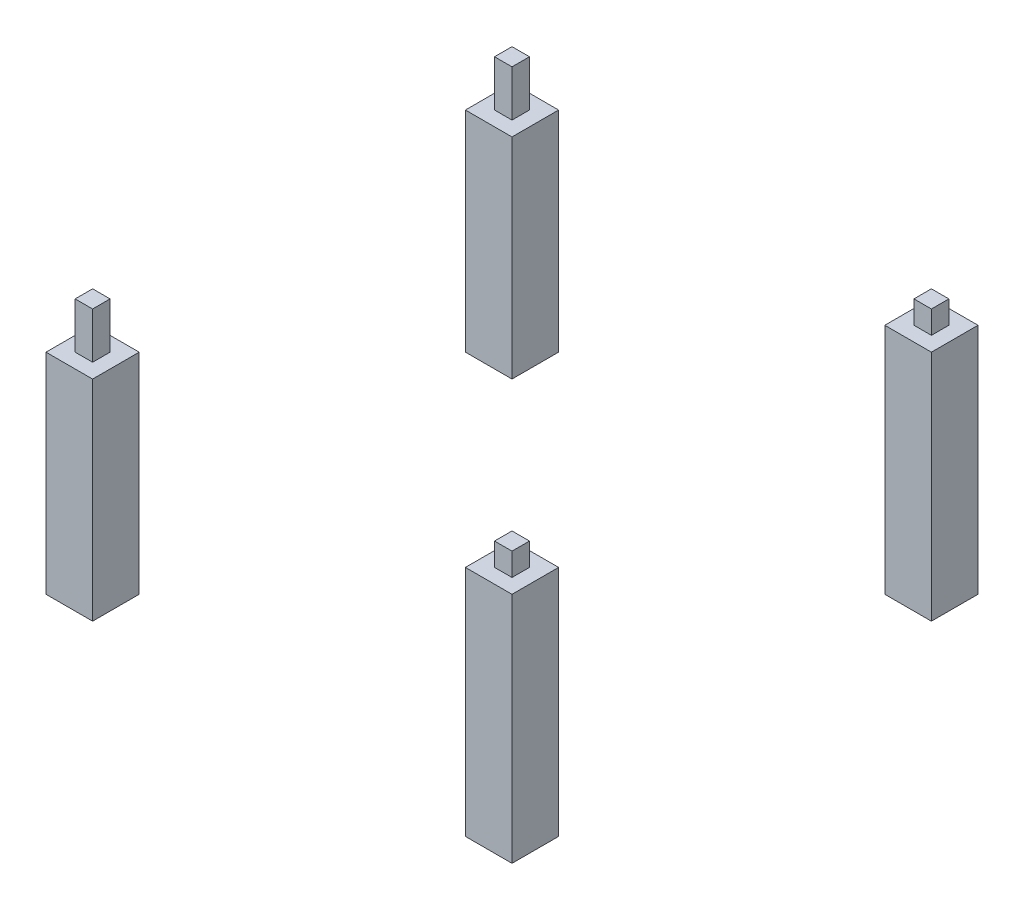
ISO-10303-21;
HEADER;
FILE_DESCRIPTION(('STEP AP214'),'2;1');
FILE_NAME('part.step','',(''),(''),'','','');
FILE_SCHEMA(('AUTOMOTIVE_DESIGN { 1 0 10303 214 1 1 1 1 }'));
ENDSEC;
DATA;
#1=APPLICATION_CONTEXT('core data for automotive mechanical design processes');
#2=APPLICATION_PROTOCOL_DEFINITION('international standard','automotive_design',2000,#1);
#3=PRODUCT_CONTEXT('',#1,'mechanical');
#4=PRODUCT('Part','Part','',(#3));
#5=PRODUCT_RELATED_PRODUCT_CATEGORY('part','',(#4));
#6=PRODUCT_DEFINITION_FORMATION('','',#4);
#7=PRODUCT_DEFINITION_CONTEXT('part definition',#1,'design');
#8=PRODUCT_DEFINITION('design','',#6,#7);
#9=PRODUCT_DEFINITION_SHAPE('','',#8);
#10=(LENGTH_UNIT() NAMED_UNIT(*) SI_UNIT(.MILLI.,.METRE.));
#11=(NAMED_UNIT(*) PLANE_ANGLE_UNIT() SI_UNIT($,.RADIAN.));
#12=(NAMED_UNIT(*) SI_UNIT($,.STERADIAN.) SOLID_ANGLE_UNIT());
#13=UNCERTAINTY_MEASURE_WITH_UNIT(LENGTH_MEASURE(1.E-05),#10,'distance_accuracy_value','');
#14=(GEOMETRIC_REPRESENTATION_CONTEXT(3) GLOBAL_UNCERTAINTY_ASSIGNED_CONTEXT((#13)) GLOBAL_UNIT_ASSIGNED_CONTEXT((#10,
#11,#12)) REPRESENTATION_CONTEXT('',''));
#15=CARTESIAN_POINT('',(0.,0.,0.));
#16=DIRECTION('',(0.,0.,1.));
#17=DIRECTION('',(1.,0.,0.));
#18=AXIS2_PLACEMENT_3D('',#15,#16,#17);
#19=CARTESIAN_POINT('',(0.,100.,0.));
#20=DIRECTION('',(0.,-1.,0.));
#21=DIRECTION('',(0.,0.,-1.));
#22=AXIS2_PLACEMENT_3D('',#19,#20,#21);
#23=PLANE('',#22);
#24=DIRECTION('',(0.,0.,-1.));
#25=VECTOR('',#24,1.);
#26=CARTESIAN_POINT('',(100.,100.,-80.));
#27=LINE('',#26,#25);
#28=CARTESIAN_POINT('',(100.,100.,-80.));
#29=VERTEX_POINT('',#28);
#30=CARTESIAN_POINT('',(100.,100.,-100.));
#31=VERTEX_POINT('',#30);
#32=EDGE_CURVE('E59',#29,#31,#27,.T.);
#33=ORIENTED_EDGE('',*,*,#32,.T.);
#34=DIRECTION('',(-1.,0.,0.));
#35=VECTOR('',#34,1.);
#36=CARTESIAN_POINT('',(80.,100.,-100.));
#37=LINE('',#36,#35);
#38=CARTESIAN_POINT('',(80.,100.,-100.));
#39=VERTEX_POINT('',#38);
#40=EDGE_CURVE('E174',#31,#39,#37,.T.);
#41=ORIENTED_EDGE('',*,*,#40,.T.);
#42=DIRECTION('',(0.,0.,1.));
#43=VECTOR('',#42,1.);
#44=CARTESIAN_POINT('',(80.,100.,-80.));
#45=LINE('',#44,#43);
#46=CARTESIAN_POINT('',(80.,100.,-80.));
#47=VERTEX_POINT('',#46);
#48=EDGE_CURVE('E173',#39,#47,#45,.T.);
#49=ORIENTED_EDGE('',*,*,#48,.T.);
#50=DIRECTION('',(1.,0.,0.));
#51=VECTOR('',#50,1.);
#52=CARTESIAN_POINT('',(80.,100.,-80.));
#53=LINE('',#52,#51);
#54=EDGE_CURVE('E166',#47,#29,#53,.T.);
#55=ORIENTED_EDGE('',*,*,#54,.T.);
#56=EDGE_LOOP('',(#33,#41,#49,#55));
#57=FACE_BOUND('',#56,.T.);
#58=DIRECTION('',(0.,0.,-1.));
#59=VECTOR('',#58,1.);
#60=CARTESIAN_POINT('',(93.75,100.,-86.25));
#61=LINE('',#60,#59);
#62=CARTESIAN_POINT('',(93.75,100.,-86.25));
#63=VERTEX_POINT('',#62);
#64=CARTESIAN_POINT('',(93.75,100.,-93.75));
#65=VERTEX_POINT('',#64);
#66=EDGE_CURVE('E72',#63,#65,#61,.T.);
#67=ORIENTED_EDGE('',*,*,#66,.F.);
#68=DIRECTION('',(1.,0.,0.));
#69=VECTOR('',#68,1.);
#70=CARTESIAN_POINT('',(86.25,100.,-86.25));
#71=LINE('',#70,#69);
#72=CARTESIAN_POINT('',(86.25,100.,-86.25));
#73=VERTEX_POINT('',#72);
#74=EDGE_CURVE('E76',#73,#63,#71,.T.);
#75=ORIENTED_EDGE('',*,*,#74,.F.);
#76=DIRECTION('',(0.,0.,1.));
#77=VECTOR('',#76,1.);
#78=CARTESIAN_POINT('',(86.25,100.,-86.25));
#79=LINE('',#78,#77);
#80=CARTESIAN_POINT('',(86.25,100.,-93.75));
#81=VERTEX_POINT('',#80);
#82=EDGE_CURVE('E117',#81,#73,#79,.T.);
#83=ORIENTED_EDGE('',*,*,#82,.F.);
#84=DIRECTION('',(-1.,0.,0.));
#85=VECTOR('',#84,1.);
#86=CARTESIAN_POINT('',(86.25,100.,-93.75));
#87=LINE('',#86,#85);
#88=EDGE_CURVE('E119',#65,#81,#87,.T.);
#89=ORIENTED_EDGE('',*,*,#88,.F.);
#90=EDGE_LOOP('',(#67,#75,#83,#89));
#91=FACE_BOUND('',#90,.T.);
#92=ADVANCED_FACE('F56',(#57,#91),#23,.F.);
#93=CARTESIAN_POINT('',(100.,100.,-80.));
#94=DIRECTION('',(-1.,0.,0.));
#95=DIRECTION('',(0.,0.,1.));
#96=AXIS2_PLACEMENT_3D('',#93,#94,#95);
#97=PLANE('',#96);
#98=DIRECTION('',(0.,0.,-1.));
#99=VECTOR('',#98,1.);
#100=CARTESIAN_POINT('',(100.,0.,-80.));
#101=LINE('',#100,#99);
#102=CARTESIAN_POINT('',(100.,0.,-80.));
#103=VERTEX_POINT('',#102);
#104=CARTESIAN_POINT('',(100.,0.,-100.));
#105=VERTEX_POINT('',#104);
#106=EDGE_CURVE('E12',#103,#105,#101,.T.);
#107=ORIENTED_EDGE('',*,*,#106,.T.);
#108=DIRECTION('',(0.,-1.,0.));
#109=VECTOR('',#108,1.);
#110=CARTESIAN_POINT('',(100.,100.,-100.));
#111=LINE('',#110,#109);
#112=EDGE_CURVE('E148',#31,#105,#111,.T.);
#113=ORIENTED_EDGE('',*,*,#112,.F.);
#114=ORIENTED_EDGE('',*,*,#32,.F.);
#115=DIRECTION('',(0.,-1.,0.));
#116=VECTOR('',#115,1.);
#117=CARTESIAN_POINT('',(100.,100.,-80.));
#118=LINE('',#117,#116);
#119=EDGE_CURVE('E163',#29,#103,#118,.T.);
#120=ORIENTED_EDGE('',*,*,#119,.T.);
#121=EDGE_LOOP('',(#107,#113,#114,#120));
#122=FACE_BOUND('',#121,.T.);
#123=ADVANCED_FACE('F183',(#122),#97,.F.);
#124=CARTESIAN_POINT('',(80.,100.,-100.));
#125=DIRECTION('',(0.,0.,1.));
#126=DIRECTION('',(1.,0.,0.));
#127=AXIS2_PLACEMENT_3D('',#124,#125,#126);
#128=PLANE('',#127);
#129=DIRECTION('',(-1.,0.,0.));
#130=VECTOR('',#129,1.);
#131=CARTESIAN_POINT('',(80.,0.,-100.));
#132=LINE('',#131,#130);
#133=CARTESIAN_POINT('',(80.,0.,-100.));
#134=VERTEX_POINT('',#133);
#135=EDGE_CURVE('E64',#105,#134,#132,.T.);
#136=ORIENTED_EDGE('',*,*,#135,.T.);
#137=DIRECTION('',(0.,-1.,0.));
#138=VECTOR('',#137,1.);
#139=CARTESIAN_POINT('',(80.,100.,-100.));
#140=LINE('',#139,#138);
#141=EDGE_CURVE('E157',#39,#134,#140,.T.);
#142=ORIENTED_EDGE('',*,*,#141,.F.);
#143=ORIENTED_EDGE('',*,*,#40,.F.);
#144=ORIENTED_EDGE('',*,*,#112,.T.);
#145=EDGE_LOOP('',(#136,#142,#143,#144));
#146=FACE_BOUND('',#145,.T.);
#147=ADVANCED_FACE('F186',(#146),#128,.F.);
#148=CARTESIAN_POINT('',(80.,100.,-80.));
#149=DIRECTION('',(1.,0.,0.));
#150=DIRECTION('',(0.,0.,-1.));
#151=AXIS2_PLACEMENT_3D('',#148,#149,#150);
#152=PLANE('',#151);
#153=DIRECTION('',(0.,0.,1.));
#154=VECTOR('',#153,1.);
#155=CARTESIAN_POINT('',(80.,0.,-80.));
#156=LINE('',#155,#154);
#157=CARTESIAN_POINT('',(80.,0.,-80.));
#158=VERTEX_POINT('',#157);
#159=EDGE_CURVE('E169',#134,#158,#156,.T.);
#160=ORIENTED_EDGE('',*,*,#159,.T.);
#161=DIRECTION('',(0.,-1.,0.));
#162=VECTOR('',#161,1.);
#163=CARTESIAN_POINT('',(80.,100.,-80.));
#164=LINE('',#163,#162);
#165=EDGE_CURVE('E160',#47,#158,#164,.T.);
#166=ORIENTED_EDGE('',*,*,#165,.F.);
#167=ORIENTED_EDGE('',*,*,#48,.F.);
#168=ORIENTED_EDGE('',*,*,#141,.T.);
#169=EDGE_LOOP('',(#160,#166,#167,#168));
#170=FACE_BOUND('',#169,.T.);
#171=ADVANCED_FACE('F191',(#170),#152,.F.);
#172=CARTESIAN_POINT('',(80.,100.,-80.));
#173=DIRECTION('',(0.,0.,-1.));
#174=DIRECTION('',(-1.,0.,0.));
#175=AXIS2_PLACEMENT_3D('',#172,#173,#174);
#176=PLANE('',#175);
#177=DIRECTION('',(1.,0.,0.));
#178=VECTOR('',#177,1.);
#179=CARTESIAN_POINT('',(80.,0.,-80.));
#180=LINE('',#179,#178);
#181=EDGE_CURVE('E167',#158,#103,#180,.T.);
#182=ORIENTED_EDGE('',*,*,#181,.T.);
#183=ORIENTED_EDGE('',*,*,#119,.F.);
#184=ORIENTED_EDGE('',*,*,#54,.F.);
#185=ORIENTED_EDGE('',*,*,#165,.T.);
#186=EDGE_LOOP('',(#182,#183,#184,#185));
#187=FACE_BOUND('',#186,.T.);
#188=ADVANCED_FACE('F194',(#187),#176,.F.);
#189=CARTESIAN_POINT('',(0.,0.,0.));
#190=DIRECTION('',(0.,-1.,0.));
#191=DIRECTION('',(0.,0.,-1.));
#192=AXIS2_PLACEMENT_3D('',#189,#190,#191);
#193=PLANE('',#192);
#194=ORIENTED_EDGE('',*,*,#106,.F.);
#195=ORIENTED_EDGE('',*,*,#181,.F.);
#196=ORIENTED_EDGE('',*,*,#159,.F.);
#197=ORIENTED_EDGE('',*,*,#135,.F.);
#198=EDGE_LOOP('',(#194,#195,#196,#197));
#199=FACE_BOUND('',#198,.T.);
#200=ADVANCED_FACE('F196',(#199),#193,.T.);
#201=CARTESIAN_POINT('',(93.75,109.8,-86.25));
#202=DIRECTION('',(-1.,0.,0.));
#203=DIRECTION('',(0.,0.,1.));
#204=AXIS2_PLACEMENT_3D('',#201,#202,#203);
#205=PLANE('',#204);
#206=ORIENTED_EDGE('',*,*,#66,.T.);
#207=DIRECTION('',(0.,-1.,0.));
#208=VECTOR('',#207,1.);
#209=CARTESIAN_POINT('',(93.75,109.8,-93.75));
#210=LINE('',#209,#208);
#211=CARTESIAN_POINT('',(93.75,109.8,-93.75));
#212=VERTEX_POINT('',#211);
#213=EDGE_CURVE('E132',#212,#65,#210,.T.);
#214=ORIENTED_EDGE('',*,*,#213,.F.);
#215=DIRECTION('',(0.,0.,-1.));
#216=VECTOR('',#215,1.);
#217=CARTESIAN_POINT('',(93.75,109.8,-86.25));
#218=LINE('',#217,#216);
#219=CARTESIAN_POINT('',(93.75,109.8,-86.25));
#220=VERTEX_POINT('',#219);
#221=EDGE_CURVE('E145',#220,#212,#218,.T.);
#222=ORIENTED_EDGE('',*,*,#221,.F.);
#223=DIRECTION('',(0.,-1.,0.));
#224=VECTOR('',#223,1.);
#225=CARTESIAN_POINT('',(93.75,109.8,-86.25));
#226=LINE('',#225,#224);
#227=EDGE_CURVE('E138',#220,#63,#226,.T.);
#228=ORIENTED_EDGE('',*,*,#227,.T.);
#229=EDGE_LOOP('',(#206,#214,#222,#228));
#230=FACE_BOUND('',#229,.T.);
#231=ADVANCED_FACE('F198',(#230),#205,.F.);
#232=CARTESIAN_POINT('',(86.25,109.8,-93.75));
#233=DIRECTION('',(0.,0.,1.));
#234=DIRECTION('',(1.,0.,0.));
#235=AXIS2_PLACEMENT_3D('',#232,#233,#234);
#236=PLANE('',#235);
#237=ORIENTED_EDGE('',*,*,#88,.T.);
#238=DIRECTION('',(0.,-1.,0.));
#239=VECTOR('',#238,1.);
#240=CARTESIAN_POINT('',(86.25,109.8,-93.75));
#241=LINE('',#240,#239);
#242=CARTESIAN_POINT('',(86.25,109.8,-93.75));
#243=VERTEX_POINT('',#242);
#244=EDGE_CURVE('E129',#243,#81,#241,.T.);
#245=ORIENTED_EDGE('',*,*,#244,.F.);
#246=DIRECTION('',(-1.,0.,0.));
#247=VECTOR('',#246,1.);
#248=CARTESIAN_POINT('',(86.25,109.8,-93.75));
#249=LINE('',#248,#247);
#250=EDGE_CURVE('E151',#212,#243,#249,.T.);
#251=ORIENTED_EDGE('',*,*,#250,.F.);
#252=ORIENTED_EDGE('',*,*,#213,.T.);
#253=EDGE_LOOP('',(#237,#245,#251,#252));
#254=FACE_BOUND('',#253,.T.);
#255=ADVANCED_FACE('F128',(#254),#236,.F.);
#256=CARTESIAN_POINT('',(86.25,109.8,-86.25));
#257=DIRECTION('',(1.,0.,0.));
#258=DIRECTION('',(0.,0.,-1.));
#259=AXIS2_PLACEMENT_3D('',#256,#257,#258);
#260=PLANE('',#259);
#261=ORIENTED_EDGE('',*,*,#82,.T.);
#262=DIRECTION('',(0.,-1.,0.));
#263=VECTOR('',#262,1.);
#264=CARTESIAN_POINT('',(86.25,109.8,-86.25));
#265=LINE('',#264,#263);
#266=CARTESIAN_POINT('',(86.25,109.8,-86.25));
#267=VERTEX_POINT('',#266);
#268=EDGE_CURVE('E136',#267,#73,#265,.T.);
#269=ORIENTED_EDGE('',*,*,#268,.F.);
#270=DIRECTION('',(0.,0.,1.));
#271=VECTOR('',#270,1.);
#272=CARTESIAN_POINT('',(86.25,109.8,-86.25));
#273=LINE('',#272,#271);
#274=EDGE_CURVE('E135',#243,#267,#273,.T.);
#275=ORIENTED_EDGE('',*,*,#274,.F.);
#276=ORIENTED_EDGE('',*,*,#244,.T.);
#277=EDGE_LOOP('',(#261,#269,#275,#276));
#278=FACE_BOUND('',#277,.T.);
#279=ADVANCED_FACE('F134',(#278),#260,.F.);
#280=CARTESIAN_POINT('',(86.25,109.8,-86.25));
#281=DIRECTION('',(0.,0.,-1.));
#282=DIRECTION('',(-1.,0.,0.));
#283=AXIS2_PLACEMENT_3D('',#280,#281,#282);
#284=PLANE('',#283);
#285=ORIENTED_EDGE('',*,*,#74,.T.);
#286=ORIENTED_EDGE('',*,*,#227,.F.);
#287=DIRECTION('',(1.,0.,0.));
#288=VECTOR('',#287,1.);
#289=CARTESIAN_POINT('',(86.25,109.8,-86.25));
#290=LINE('',#289,#288);
#291=EDGE_CURVE('E144',#267,#220,#290,.T.);
#292=ORIENTED_EDGE('',*,*,#291,.F.);
#293=ORIENTED_EDGE('',*,*,#268,.T.);
#294=EDGE_LOOP('',(#285,#286,#292,#293));
#295=FACE_BOUND('',#294,.T.);
#296=ADVANCED_FACE('F263',(#295),#284,.F.);
#297=CARTESIAN_POINT('',(0.,109.8,0.));
#298=DIRECTION('',(0.,-1.,0.));
#299=DIRECTION('',(0.,0.,-1.));
#300=AXIS2_PLACEMENT_3D('',#297,#298,#299);
#301=PLANE('',#300);
#302=ORIENTED_EDGE('',*,*,#221,.T.);
#303=ORIENTED_EDGE('',*,*,#250,.T.);
#304=ORIENTED_EDGE('',*,*,#274,.T.);
#305=ORIENTED_EDGE('',*,*,#291,.T.);
#306=EDGE_LOOP('',(#302,#303,#304,#305));
#307=FACE_BOUND('',#306,.T.);
#308=ADVANCED_FACE('F216',(#307),#301,.F.);
#309=CLOSED_SHELL('',(#92,#123,#147,#171,#188,#200,#231,#255,#279,#296,#308));
#310=MANIFOLD_SOLID_BREP('B2',#309);
#311=CARTESIAN_POINT('',(0.,100.,0.));
#312=DIRECTION('',(0.,-1.,0.));
#313=DIRECTION('',(0.,0.,-1.));
#314=AXIS2_PLACEMENT_3D('',#311,#312,#313);
#315=PLANE('',#314);
#316=DIRECTION('',(0.,0.,-1.));
#317=VECTOR('',#316,1.);
#318=CARTESIAN_POINT('',(100.,100.,100.));
#319=LINE('',#318,#317);
#320=CARTESIAN_POINT('',(100.,100.,100.));
#321=VERTEX_POINT('',#320);
#322=CARTESIAN_POINT('',(100.,100.,80.));
#323=VERTEX_POINT('',#322);
#324=EDGE_CURVE('E427',#321,#323,#319,.T.);
#325=ORIENTED_EDGE('',*,*,#324,.T.);
#326=DIRECTION('',(-1.,0.,0.));
#327=VECTOR('',#326,1.);
#328=CARTESIAN_POINT('',(80.,100.,80.));
#329=LINE('',#328,#327);
#330=CARTESIAN_POINT('',(80.,100.,80.));
#331=VERTEX_POINT('',#330);
#332=EDGE_CURVE('E431',#323,#331,#329,.T.);
#333=ORIENTED_EDGE('',*,*,#332,.T.);
#334=DIRECTION('',(0.,0.,1.));
#335=VECTOR('',#334,1.);
#336=CARTESIAN_POINT('',(80.,100.,100.));
#337=LINE('',#336,#335);
#338=CARTESIAN_POINT('',(80.,100.,100.));
#339=VERTEX_POINT('',#338);
#340=EDGE_CURVE('E435',#331,#339,#337,.T.);
#341=ORIENTED_EDGE('',*,*,#340,.T.);
#342=DIRECTION('',(1.,0.,0.));
#343=VECTOR('',#342,1.);
#344=CARTESIAN_POINT('',(80.,100.,100.));
#345=LINE('',#344,#343);
#346=EDGE_CURVE('E438',#339,#321,#345,.T.);
#347=ORIENTED_EDGE('',*,*,#346,.T.);
#348=EDGE_LOOP('',(#325,#333,#341,#347));
#349=FACE_BOUND('',#348,.T.);
#350=DIRECTION('',(0.,0.,-1.));
#351=VECTOR('',#350,1.);
#352=CARTESIAN_POINT('',(93.75,100.,93.75));
#353=LINE('',#352,#351);
#354=CARTESIAN_POINT('',(93.75,100.,93.75));
#355=VERTEX_POINT('',#354);
#356=CARTESIAN_POINT('',(93.75,100.,86.25));
#357=VERTEX_POINT('',#356);
#358=EDGE_CURVE('E343',#355,#357,#353,.T.);
#359=ORIENTED_EDGE('',*,*,#358,.F.);
#360=DIRECTION('',(1.,0.,0.));
#361=VECTOR('',#360,1.);
#362=CARTESIAN_POINT('',(86.25,100.,93.75));
#363=LINE('',#362,#361);
#364=CARTESIAN_POINT('',(86.25,100.,93.75));
#365=VERTEX_POINT('',#364);
#366=EDGE_CURVE('E347',#365,#355,#363,.T.);
#367=ORIENTED_EDGE('',*,*,#366,.F.);
#368=DIRECTION('',(0.,0.,1.));
#369=VECTOR('',#368,1.);
#370=CARTESIAN_POINT('',(86.25,100.,93.75));
#371=LINE('',#370,#369);
#372=CARTESIAN_POINT('',(86.25,100.,86.25));
#373=VERTEX_POINT('',#372);
#374=EDGE_CURVE('E593',#373,#365,#371,.T.);
#375=ORIENTED_EDGE('',*,*,#374,.F.);
#376=DIRECTION('',(-1.,0.,0.));
#377=VECTOR('',#376,1.);
#378=CARTESIAN_POINT('',(86.25,100.,86.25));
#379=LINE('',#378,#377);
#380=EDGE_CURVE('E603',#357,#373,#379,.T.);
#381=ORIENTED_EDGE('',*,*,#380,.F.);
#382=EDGE_LOOP('',(#359,#367,#375,#381));
#383=FACE_BOUND('',#382,.T.);
#384=ADVANCED_FACE('F327',(#349,#383),#315,.F.);
#385=CARTESIAN_POINT('',(100.,100.,100.));
#386=DIRECTION('',(-1.,0.,0.));
#387=DIRECTION('',(0.,0.,1.));
#388=AXIS2_PLACEMENT_3D('',#385,#386,#387);
#389=PLANE('',#388);
#390=DIRECTION('',(0.,0.,-1.));
#391=VECTOR('',#390,1.);
#392=CARTESIAN_POINT('',(100.,0.,100.));
#393=LINE('',#392,#391);
#394=CARTESIAN_POINT('',(100.,0.,100.));
#395=VERTEX_POINT('',#394);
#396=CARTESIAN_POINT('',(100.,0.,80.));
#397=VERTEX_POINT('',#396);
#398=EDGE_CURVE('E416',#395,#397,#393,.T.);
#399=ORIENTED_EDGE('',*,*,#398,.T.);
#400=DIRECTION('',(0.,-1.,0.));
#401=VECTOR('',#400,1.);
#402=CARTESIAN_POINT('',(100.,100.,80.));
#403=LINE('',#402,#401);
#404=EDGE_CURVE('E54',#323,#397,#403,.T.);
#405=ORIENTED_EDGE('',*,*,#404,.F.);
#406=ORIENTED_EDGE('',*,*,#324,.F.);
#407=DIRECTION('',(0.,-1.,0.));
#408=VECTOR('',#407,1.);
#409=CARTESIAN_POINT('',(100.,100.,100.));
#410=LINE('',#409,#408);
#411=EDGE_CURVE('E440',#321,#395,#410,.T.);
#412=ORIENTED_EDGE('',*,*,#411,.T.);
#413=EDGE_LOOP('',(#399,#405,#406,#412));
#414=FACE_BOUND('',#413,.T.);
#415=ADVANCED_FACE('F329',(#414),#389,.F.);
#416=CARTESIAN_POINT('',(80.,100.,80.));
#417=DIRECTION('',(0.,0.,1.));
#418=DIRECTION('',(1.,0.,0.));
#419=AXIS2_PLACEMENT_3D('',#416,#417,#418);
#420=PLANE('',#419);
#421=DIRECTION('',(-1.,0.,0.));
#422=VECTOR('',#421,1.);
#423=CARTESIAN_POINT('',(80.,0.,80.));
#424=LINE('',#423,#422);
#425=CARTESIAN_POINT('',(80.,0.,80.));
#426=VERTEX_POINT('',#425);
#427=EDGE_CURVE('E421',#397,#426,#424,.T.);
#428=ORIENTED_EDGE('',*,*,#427,.T.);
#429=DIRECTION('',(0.,-1.,0.));
#430=VECTOR('',#429,1.);
#431=CARTESIAN_POINT('',(80.,100.,80.));
#432=LINE('',#431,#430);
#433=EDGE_CURVE('E336',#331,#426,#432,.T.);
#434=ORIENTED_EDGE('',*,*,#433,.F.);
#435=ORIENTED_EDGE('',*,*,#332,.F.);
#436=ORIENTED_EDGE('',*,*,#404,.T.);
#437=EDGE_LOOP('',(#428,#434,#435,#436));
#438=FACE_BOUND('',#437,.T.);
#439=ADVANCED_FACE('F476',(#438),#420,.F.);
#440=CARTESIAN_POINT('',(80.,100.,100.));
#441=DIRECTION('',(1.,0.,0.));
#442=DIRECTION('',(0.,0.,-1.));
#443=AXIS2_PLACEMENT_3D('',#440,#441,#442);
#444=PLANE('',#443);
#445=DIRECTION('',(0.,0.,1.));
#446=VECTOR('',#445,1.);
#447=CARTESIAN_POINT('',(80.,0.,100.));
#448=LINE('',#447,#446);
#449=CARTESIAN_POINT('',(80.,0.,100.));
#450=VERTEX_POINT('',#449);
#451=EDGE_CURVE('E444',#426,#450,#448,.T.);
#452=ORIENTED_EDGE('',*,*,#451,.T.);
#453=DIRECTION('',(0.,-1.,0.));
#454=VECTOR('',#453,1.);
#455=CARTESIAN_POINT('',(80.,100.,100.));
#456=LINE('',#455,#454);
#457=EDGE_CURVE('E452',#339,#450,#456,.T.);
#458=ORIENTED_EDGE('',*,*,#457,.F.);
#459=ORIENTED_EDGE('',*,*,#340,.F.);
#460=ORIENTED_EDGE('',*,*,#433,.T.);
#461=EDGE_LOOP('',(#452,#458,#459,#460));
#462=FACE_BOUND('',#461,.T.);
#463=ADVANCED_FACE('F461',(#462),#444,.F.);
#464=CARTESIAN_POINT('',(80.,100.,100.));
#465=DIRECTION('',(0.,0.,-1.));
#466=DIRECTION('',(-1.,0.,0.));
#467=AXIS2_PLACEMENT_3D('',#464,#465,#466);
#468=PLANE('',#467);
#469=DIRECTION('',(1.,0.,0.));
#470=VECTOR('',#469,1.);
#471=CARTESIAN_POINT('',(80.,0.,100.));
#472=LINE('',#471,#470);
#473=EDGE_CURVE('E432',#450,#395,#472,.T.);
#474=ORIENTED_EDGE('',*,*,#473,.T.);
#475=ORIENTED_EDGE('',*,*,#411,.F.);
#476=ORIENTED_EDGE('',*,*,#346,.F.);
#477=ORIENTED_EDGE('',*,*,#457,.T.);
#478=EDGE_LOOP('',(#474,#475,#476,#477));
#479=FACE_BOUND('',#478,.T.);
#480=ADVANCED_FACE('F470',(#479),#468,.F.);
#481=CARTESIAN_POINT('',(0.,0.,0.));
#482=DIRECTION('',(0.,-1.,0.));
#483=DIRECTION('',(0.,0.,-1.));
#484=AXIS2_PLACEMENT_3D('',#481,#482,#483);
#485=PLANE('',#484);
#486=ORIENTED_EDGE('',*,*,#398,.F.);
#487=ORIENTED_EDGE('',*,*,#473,.F.);
#488=ORIENTED_EDGE('',*,*,#451,.F.);
#489=ORIENTED_EDGE('',*,*,#427,.F.);
#490=EDGE_LOOP('',(#486,#487,#488,#489));
#491=FACE_BOUND('',#490,.T.);
#492=ADVANCED_FACE('F467',(#491),#485,.T.);
#493=CARTESIAN_POINT('',(93.75,109.8,93.75));
#494=DIRECTION('',(-1.,0.,0.));
#495=DIRECTION('',(0.,0.,1.));
#496=AXIS2_PLACEMENT_3D('',#493,#494,#495);
#497=PLANE('',#496);
#498=ORIENTED_EDGE('',*,*,#358,.T.);
#499=DIRECTION('',(0.,-1.,0.));
#500=VECTOR('',#499,1.);
#501=CARTESIAN_POINT('',(93.75,109.8,86.25));
#502=LINE('',#501,#500);
#503=CARTESIAN_POINT('',(93.75,109.8,86.25));
#504=VERTEX_POINT('',#503);
#505=EDGE_CURVE('E396',#504,#357,#502,.T.);
#506=ORIENTED_EDGE('',*,*,#505,.F.);
#507=DIRECTION('',(0.,0.,-1.));
#508=VECTOR('',#507,1.);
#509=CARTESIAN_POINT('',(93.75,109.8,93.75));
#510=LINE('',#509,#508);
#511=CARTESIAN_POINT('',(93.75,109.8,93.75));
#512=VERTEX_POINT('',#511);
#513=EDGE_CURVE('E403',#512,#504,#510,.T.);
#514=ORIENTED_EDGE('',*,*,#513,.F.);
#515=DIRECTION('',(0.,-1.,0.));
#516=VECTOR('',#515,1.);
#517=CARTESIAN_POINT('',(93.75,109.8,93.75));
#518=LINE('',#517,#516);
#519=EDGE_CURVE('E590',#512,#355,#518,.T.);
#520=ORIENTED_EDGE('',*,*,#519,.T.);
#521=EDGE_LOOP('',(#498,#506,#514,#520));
#522=FACE_BOUND('',#521,.T.);
#523=ADVANCED_FACE('F414',(#522),#497,.F.);
#524=CARTESIAN_POINT('',(86.25,109.8,86.25));
#525=DIRECTION('',(0.,0.,1.));
#526=DIRECTION('',(1.,0.,0.));
#527=AXIS2_PLACEMENT_3D('',#524,#525,#526);
#528=PLANE('',#527);
#529=ORIENTED_EDGE('',*,*,#380,.T.);
#530=DIRECTION('',(0.,-1.,0.));
#531=VECTOR('',#530,1.);
#532=CARTESIAN_POINT('',(86.25,109.8,86.25));
#533=LINE('',#532,#531);
#534=CARTESIAN_POINT('',(86.25,109.8,86.25));
#535=VERTEX_POINT('',#534);
#536=EDGE_CURVE('E398',#535,#373,#533,.T.);
#537=ORIENTED_EDGE('',*,*,#536,.F.);
#538=DIRECTION('',(-1.,0.,0.));
#539=VECTOR('',#538,1.);
#540=CARTESIAN_POINT('',(86.25,109.8,86.25));
#541=LINE('',#540,#539);
#542=EDGE_CURVE('E391',#504,#535,#541,.T.);
#543=ORIENTED_EDGE('',*,*,#542,.F.);
#544=ORIENTED_EDGE('',*,*,#505,.T.);
#545=EDGE_LOOP('',(#529,#537,#543,#544));
#546=FACE_BOUND('',#545,.T.);
#547=ADVANCED_FACE('F394',(#546),#528,.F.);
#548=CARTESIAN_POINT('',(86.25,109.8,93.75));
#549=DIRECTION('',(1.,0.,0.));
#550=DIRECTION('',(0.,0.,-1.));
#551=AXIS2_PLACEMENT_3D('',#548,#549,#550);
#552=PLANE('',#551);
#553=ORIENTED_EDGE('',*,*,#374,.T.);
#554=DIRECTION('',(0.,-1.,0.));
#555=VECTOR('',#554,1.);
#556=CARTESIAN_POINT('',(86.25,109.8,93.75));
#557=LINE('',#556,#555);
#558=CARTESIAN_POINT('',(86.25,109.8,93.75));
#559=VERTEX_POINT('',#558);
#560=EDGE_CURVE('E423',#559,#365,#557,.T.);
#561=ORIENTED_EDGE('',*,*,#560,.F.);
#562=DIRECTION('',(0.,0.,1.));
#563=VECTOR('',#562,1.);
#564=CARTESIAN_POINT('',(86.25,109.8,93.75));
#565=LINE('',#564,#563);
#566=EDGE_CURVE('E402',#535,#559,#565,.T.);
#567=ORIENTED_EDGE('',*,*,#566,.F.);
#568=ORIENTED_EDGE('',*,*,#536,.T.);
#569=EDGE_LOOP('',(#553,#561,#567,#568));
#570=FACE_BOUND('',#569,.T.);
#571=ADVANCED_FACE('F512',(#570),#552,.F.);
#572=CARTESIAN_POINT('',(86.25,109.8,93.75));
#573=DIRECTION('',(0.,0.,-1.));
#574=DIRECTION('',(-1.,0.,0.));
#575=AXIS2_PLACEMENT_3D('',#572,#573,#574);
#576=PLANE('',#575);
#577=ORIENTED_EDGE('',*,*,#366,.T.);
#578=ORIENTED_EDGE('',*,*,#519,.F.);
#579=DIRECTION('',(1.,0.,0.));
#580=VECTOR('',#579,1.);
#581=CARTESIAN_POINT('',(86.25,109.8,93.75));
#582=LINE('',#581,#580);
#583=EDGE_CURVE('E408',#559,#512,#582,.T.);
#584=ORIENTED_EDGE('',*,*,#583,.F.);
#585=ORIENTED_EDGE('',*,*,#560,.T.);
#586=EDGE_LOOP('',(#577,#578,#584,#585));
#587=FACE_BOUND('',#586,.T.);
#588=ADVANCED_FACE('F518',(#587),#576,.F.);
#589=CARTESIAN_POINT('',(0.,109.8,0.));
#590=DIRECTION('',(0.,-1.,0.));
#591=DIRECTION('',(0.,0.,-1.));
#592=AXIS2_PLACEMENT_3D('',#589,#590,#591);
#593=PLANE('',#592);
#594=ORIENTED_EDGE('',*,*,#513,.T.);
#595=ORIENTED_EDGE('',*,*,#542,.T.);
#596=ORIENTED_EDGE('',*,*,#566,.T.);
#597=ORIENTED_EDGE('',*,*,#583,.T.);
#598=EDGE_LOOP('',(#594,#595,#596,#597));
#599=FACE_BOUND('',#598,.T.);
#600=ADVANCED_FACE('F406',(#599),#593,.F.);
#601=CLOSED_SHELL('',(#384,#415,#439,#463,#480,#492,#523,#547,#571,#588,#600));
#602=MANIFOLD_SOLID_BREP('B6',#601);
#603=CARTESIAN_POINT('',(-100.,90.,-80.));
#604=DIRECTION('',(0.,0.,-1.));
#605=DIRECTION('',(-1.,0.,0.));
#606=AXIS2_PLACEMENT_3D('',#603,#604,#605);
#607=PLANE('',#606);
#608=DIRECTION('',(1.,0.,0.));
#609=VECTOR('',#608,1.);
#610=CARTESIAN_POINT('',(-100.,0.,-80.));
#611=LINE('',#610,#609);
#612=CARTESIAN_POINT('',(-100.,0.,-80.));
#613=VERTEX_POINT('',#612);
#614=CARTESIAN_POINT('',(-80.,0.,-80.));
#615=VERTEX_POINT('',#614);
#616=EDGE_CURVE('E325',#613,#615,#611,.T.);
#617=ORIENTED_EDGE('',*,*,#616,.T.);
#618=DIRECTION('',(0.,-1.,0.));
#619=VECTOR('',#618,1.);
#620=CARTESIAN_POINT('',(-80.,90.,-80.));
#621=LINE('',#620,#619);
#622=CARTESIAN_POINT('',(-80.,90.,-80.));
#623=VERTEX_POINT('',#622);
#624=EDGE_CURVE('E715',#623,#615,#621,.T.);
#625=ORIENTED_EDGE('',*,*,#624,.F.);
#626=DIRECTION('',(1.,0.,0.));
#627=VECTOR('',#626,1.);
#628=CARTESIAN_POINT('',(-100.,90.,-80.));
#629=LINE('',#628,#627);
#630=CARTESIAN_POINT('',(-100.,90.,-80.));
#631=VERTEX_POINT('',#630);
#632=EDGE_CURVE('E625',#631,#623,#629,.T.);
#633=ORIENTED_EDGE('',*,*,#632,.F.);
#634=DIRECTION('',(0.,-1.,0.));
#635=VECTOR('',#634,1.);
#636=CARTESIAN_POINT('',(-100.,90.,-80.));
#637=LINE('',#636,#635);
#638=EDGE_CURVE('E728',#631,#613,#637,.T.);
#639=ORIENTED_EDGE('',*,*,#638,.T.);
#640=EDGE_LOOP('',(#617,#625,#633,#639));
#641=FACE_BOUND('',#640,.T.);
#642=ADVANCED_FACE('F621',(#641),#607,.F.);
#643=CARTESIAN_POINT('',(-80.,90.,-80.));
#644=DIRECTION('',(-1.,0.,0.));
#645=DIRECTION('',(0.,0.,1.));
#646=AXIS2_PLACEMENT_3D('',#643,#644,#645);
#647=PLANE('',#646);
#648=DIRECTION('',(0.,0.,-1.));
#649=VECTOR('',#648,1.);
#650=CARTESIAN_POINT('',(-80.,0.,-80.));
#651=LINE('',#650,#649);
#652=CARTESIAN_POINT('',(-80.,0.,-100.));
#653=VERTEX_POINT('',#652);
#654=EDGE_CURVE('E630',#615,#653,#651,.T.);
#655=ORIENTED_EDGE('',*,*,#654,.T.);
#656=DIRECTION('',(0.,-1.,0.));
#657=VECTOR('',#656,1.);
#658=CARTESIAN_POINT('',(-80.,90.,-100.));
#659=LINE('',#658,#657);
#660=CARTESIAN_POINT('',(-80.,90.,-100.));
#661=VERTEX_POINT('',#660);
#662=EDGE_CURVE('E724',#661,#653,#659,.T.);
#663=ORIENTED_EDGE('',*,*,#662,.F.);
#664=DIRECTION('',(0.,0.,-1.));
#665=VECTOR('',#664,1.);
#666=CARTESIAN_POINT('',(-80.,90.,-80.));
#667=LINE('',#666,#665);
#668=EDGE_CURVE('E743',#623,#661,#667,.T.);
#669=ORIENTED_EDGE('',*,*,#668,.F.);
#670=ORIENTED_EDGE('',*,*,#624,.T.);
#671=EDGE_LOOP('',(#655,#663,#669,#670));
#672=FACE_BOUND('',#671,.T.);
#673=ADVANCED_FACE('F753',(#672),#647,.F.);
#674=CARTESIAN_POINT('',(-100.,90.,-100.));
#675=DIRECTION('',(0.,0.,-1.));
#676=DIRECTION('',(-1.,0.,0.));
#677=AXIS2_PLACEMENT_3D('',#674,#675,#676);
#678=PLANE('',#677);
#679=DIRECTION('',(1.,0.,0.));
#680=VECTOR('',#679,1.);
#681=CARTESIAN_POINT('',(-100.,0.,-100.));
#682=LINE('',#681,#680);
#683=CARTESIAN_POINT('',(-100.,0.,-100.));
#684=VERTEX_POINT('',#683);
#685=EDGE_CURVE('E734',#684,#653,#682,.T.);
#686=ORIENTED_EDGE('',*,*,#685,.F.);
#687=DIRECTION('',(0.,-1.,0.));
#688=VECTOR('',#687,1.);
#689=CARTESIAN_POINT('',(-100.,90.,-100.));
#690=LINE('',#689,#688);
#691=CARTESIAN_POINT('',(-100.,90.,-100.));
#692=VERTEX_POINT('',#691);
#693=EDGE_CURVE('E726',#692,#684,#690,.T.);
#694=ORIENTED_EDGE('',*,*,#693,.F.);
#695=DIRECTION('',(1.,0.,0.));
#696=VECTOR('',#695,1.);
#697=CARTESIAN_POINT('',(-100.,90.,-100.));
#698=LINE('',#697,#696);
#699=EDGE_CURVE('E741',#692,#661,#698,.T.);
#700=ORIENTED_EDGE('',*,*,#699,.T.);
#701=ORIENTED_EDGE('',*,*,#662,.T.);
#702=EDGE_LOOP('',(#686,#694,#700,#701));
#703=FACE_BOUND('',#702,.T.);
#704=ADVANCED_FACE('F756',(#703),#678,.T.);
#705=CARTESIAN_POINT('',(-100.,90.,-80.));
#706=DIRECTION('',(-1.,0.,0.));
#707=DIRECTION('',(0.,0.,1.));
#708=AXIS2_PLACEMENT_3D('',#705,#706,#707);
#709=PLANE('',#708);
#710=DIRECTION('',(0.,0.,-1.));
#711=VECTOR('',#710,1.);
#712=CARTESIAN_POINT('',(-100.,0.,-80.));
#713=LINE('',#712,#711);
#714=EDGE_CURVE('E731',#613,#684,#713,.T.);
#715=ORIENTED_EDGE('',*,*,#714,.F.);
#716=ORIENTED_EDGE('',*,*,#638,.F.);
#717=DIRECTION('',(0.,0.,-1.));
#718=VECTOR('',#717,1.);
#719=CARTESIAN_POINT('',(-100.,90.,-80.));
#720=LINE('',#719,#718);
#721=EDGE_CURVE('E730',#631,#692,#720,.T.);
#722=ORIENTED_EDGE('',*,*,#721,.T.);
#723=ORIENTED_EDGE('',*,*,#693,.T.);
#724=EDGE_LOOP('',(#715,#716,#722,#723));
#725=FACE_BOUND('',#724,.T.);
#726=ADVANCED_FACE('F759',(#725),#709,.T.);
#727=CARTESIAN_POINT('',(0.,90.,0.));
#728=DIRECTION('',(0.,1.,0.));
#729=DIRECTION('',(0.,0.,1.));
#730=AXIS2_PLACEMENT_3D('',#727,#728,#729);
#731=PLANE('',#730);
#732=DIRECTION('',(0.,0.,-1.));
#733=VECTOR('',#732,1.);
#734=CARTESIAN_POINT('',(-86.25,90.,-86.25));
#735=LINE('',#734,#733);
#736=CARTESIAN_POINT('',(-86.25,90.,-86.25));
#737=VERTEX_POINT('',#736);
#738=CARTESIAN_POINT('',(-86.25,90.,-93.75));
#739=VERTEX_POINT('',#738);
#740=EDGE_CURVE('E638',#737,#739,#735,.T.);
#741=ORIENTED_EDGE('',*,*,#740,.F.);
#742=DIRECTION('',(1.,0.,0.));
#743=VECTOR('',#742,1.);
#744=CARTESIAN_POINT('',(-93.75,90.,-86.25));
#745=LINE('',#744,#743);
#746=CARTESIAN_POINT('',(-93.75,90.,-86.25));
#747=VERTEX_POINT('',#746);
#748=EDGE_CURVE('E642',#747,#737,#745,.T.);
#749=ORIENTED_EDGE('',*,*,#748,.F.);
#750=DIRECTION('',(0.,0.,1.));
#751=VECTOR('',#750,1.);
#752=CARTESIAN_POINT('',(-93.75,90.,-86.25));
#753=LINE('',#752,#751);
#754=CARTESIAN_POINT('',(-93.75,90.,-93.75));
#755=VERTEX_POINT('',#754);
#756=EDGE_CURVE('E683',#755,#747,#753,.T.);
#757=ORIENTED_EDGE('',*,*,#756,.F.);
#758=DIRECTION('',(-1.,0.,0.));
#759=VECTOR('',#758,1.);
#760=CARTESIAN_POINT('',(-93.75,90.,-93.75));
#761=LINE('',#760,#759);
#762=EDGE_CURVE('E686',#739,#755,#761,.T.);
#763=ORIENTED_EDGE('',*,*,#762,.F.);
#764=EDGE_LOOP('',(#741,#749,#757,#763));
#765=FACE_BOUND('',#764,.T.);
#766=ORIENTED_EDGE('',*,*,#632,.T.);
#767=ORIENTED_EDGE('',*,*,#668,.T.);
#768=ORIENTED_EDGE('',*,*,#699,.F.);
#769=ORIENTED_EDGE('',*,*,#721,.F.);
#770=EDGE_LOOP('',(#766,#767,#768,#769));
#771=FACE_BOUND('',#770,.T.);
#772=ADVANCED_FACE('F623',(#765,#771),#731,.T.);
#773=CARTESIAN_POINT('',(0.,0.,0.));
#774=DIRECTION('',(0.,1.,0.));
#775=DIRECTION('',(0.,0.,1.));
#776=AXIS2_PLACEMENT_3D('',#773,#774,#775);
#777=PLANE('',#776);
#778=ORIENTED_EDGE('',*,*,#616,.F.);
#779=ORIENTED_EDGE('',*,*,#714,.T.);
#780=ORIENTED_EDGE('',*,*,#685,.T.);
#781=ORIENTED_EDGE('',*,*,#654,.F.);
#782=EDGE_LOOP('',(#778,#779,#780,#781));
#783=FACE_BOUND('',#782,.T.);
#784=ADVANCED_FACE('F761',(#783),#777,.F.);
#785=CARTESIAN_POINT('',(-86.25,109.8,-86.25));
#786=DIRECTION('',(-1.,0.,0.));
#787=DIRECTION('',(0.,0.,1.));
#788=AXIS2_PLACEMENT_3D('',#785,#786,#787);
#789=PLANE('',#788);
#790=ORIENTED_EDGE('',*,*,#740,.T.);
#791=DIRECTION('',(0.,-1.,0.));
#792=VECTOR('',#791,1.);
#793=CARTESIAN_POINT('',(-86.25,109.8,-93.75));
#794=LINE('',#793,#792);
#795=CARTESIAN_POINT('',(-86.25,109.8,-93.75));
#796=VERTEX_POINT('',#795);
#797=EDGE_CURVE('E699',#796,#739,#794,.T.);
#798=ORIENTED_EDGE('',*,*,#797,.F.);
#799=DIRECTION('',(0.,0.,-1.));
#800=VECTOR('',#799,1.);
#801=CARTESIAN_POINT('',(-86.25,109.8,-86.25));
#802=LINE('',#801,#800);
#803=CARTESIAN_POINT('',(-86.25,109.8,-86.25));
#804=VERTEX_POINT('',#803);
#805=EDGE_CURVE('E712',#804,#796,#802,.T.);
#806=ORIENTED_EDGE('',*,*,#805,.F.);
#807=DIRECTION('',(0.,-1.,0.));
#808=VECTOR('',#807,1.);
#809=CARTESIAN_POINT('',(-86.25,109.8,-86.25));
#810=LINE('',#809,#808);
#811=EDGE_CURVE('E705',#804,#737,#810,.T.);
#812=ORIENTED_EDGE('',*,*,#811,.T.);
#813=EDGE_LOOP('',(#790,#798,#806,#812));
#814=FACE_BOUND('',#813,.T.);
#815=ADVANCED_FACE('F763',(#814),#789,.F.);
#816=CARTESIAN_POINT('',(-93.75,109.8,-93.75));
#817=DIRECTION('',(0.,0.,1.));
#818=DIRECTION('',(1.,0.,0.));
#819=AXIS2_PLACEMENT_3D('',#816,#817,#818);
#820=PLANE('',#819);
#821=ORIENTED_EDGE('',*,*,#762,.T.);
#822=DIRECTION('',(0.,-1.,0.));
#823=VECTOR('',#822,1.);
#824=CARTESIAN_POINT('',(-93.75,109.8,-93.75));
#825=LINE('',#824,#823);
#826=CARTESIAN_POINT('',(-93.75,109.8,-93.75));
#827=VERTEX_POINT('',#826);
#828=EDGE_CURVE('E696',#827,#755,#825,.T.);
#829=ORIENTED_EDGE('',*,*,#828,.F.);
#830=DIRECTION('',(-1.,0.,0.));
#831=VECTOR('',#830,1.);
#832=CARTESIAN_POINT('',(-93.75,109.8,-93.75));
#833=LINE('',#832,#831);
#834=EDGE_CURVE('E718',#796,#827,#833,.T.);
#835=ORIENTED_EDGE('',*,*,#834,.F.);
#836=ORIENTED_EDGE('',*,*,#797,.T.);
#837=EDGE_LOOP('',(#821,#829,#835,#836));
#838=FACE_BOUND('',#837,.T.);
#839=ADVANCED_FACE('F695',(#838),#820,.F.);
#840=CARTESIAN_POINT('',(-93.75,109.8,-86.25));
#841=DIRECTION('',(1.,0.,0.));
#842=DIRECTION('',(0.,0.,-1.));
#843=AXIS2_PLACEMENT_3D('',#840,#841,#842);
#844=PLANE('',#843);
#845=ORIENTED_EDGE('',*,*,#756,.T.);
#846=DIRECTION('',(0.,-1.,0.));
#847=VECTOR('',#846,1.);
#848=CARTESIAN_POINT('',(-93.75,109.8,-86.25));
#849=LINE('',#848,#847);
#850=CARTESIAN_POINT('',(-93.75,109.8,-86.25));
#851=VERTEX_POINT('',#850);
#852=EDGE_CURVE('E703',#851,#747,#849,.T.);
#853=ORIENTED_EDGE('',*,*,#852,.F.);
#854=DIRECTION('',(0.,0.,1.));
#855=VECTOR('',#854,1.);
#856=CARTESIAN_POINT('',(-93.75,109.8,-86.25));
#857=LINE('',#856,#855);
#858=EDGE_CURVE('E702',#827,#851,#857,.T.);
#859=ORIENTED_EDGE('',*,*,#858,.F.);
#860=ORIENTED_EDGE('',*,*,#828,.T.);
#861=EDGE_LOOP('',(#845,#853,#859,#860));
#862=FACE_BOUND('',#861,.T.);
#863=ADVANCED_FACE('F701',(#862),#844,.F.);
#864=CARTESIAN_POINT('',(-93.75,109.8,-86.25));
#865=DIRECTION('',(0.,0.,-1.));
#866=DIRECTION('',(-1.,0.,0.));
#867=AXIS2_PLACEMENT_3D('',#864,#865,#866);
#868=PLANE('',#867);
#869=ORIENTED_EDGE('',*,*,#748,.T.);
#870=ORIENTED_EDGE('',*,*,#811,.F.);
#871=DIRECTION('',(1.,0.,0.));
#872=VECTOR('',#871,1.);
#873=CARTESIAN_POINT('',(-93.75,109.8,-86.25));
#874=LINE('',#873,#872);
#875=EDGE_CURVE('E711',#851,#804,#874,.T.);
#876=ORIENTED_EDGE('',*,*,#875,.F.);
#877=ORIENTED_EDGE('',*,*,#852,.T.);
#878=EDGE_LOOP('',(#869,#870,#876,#877));
#879=FACE_BOUND('',#878,.T.);
#880=ADVANCED_FACE('F819',(#879),#868,.F.);
#881=CARTESIAN_POINT('',(0.,109.8,0.));
#882=DIRECTION('',(0.,-1.,0.));
#883=DIRECTION('',(0.,0.,-1.));
#884=AXIS2_PLACEMENT_3D('',#881,#882,#883);
#885=PLANE('',#884);
#886=ORIENTED_EDGE('',*,*,#805,.T.);
#887=ORIENTED_EDGE('',*,*,#834,.T.);
#888=ORIENTED_EDGE('',*,*,#858,.T.);
#889=ORIENTED_EDGE('',*,*,#875,.T.);
#890=EDGE_LOOP('',(#886,#887,#888,#889));
#891=FACE_BOUND('',#890,.T.);
#892=ADVANCED_FACE('F778',(#891),#885,.F.);
#893=CLOSED_SHELL('',(#642,#673,#704,#726,#772,#784,#815,#839,#863,#880,#892));
#894=MANIFOLD_SOLID_BREP('B48',#893);
#895=CARTESIAN_POINT('',(0.,90.,100.));
#896=DIRECTION('',(0.,0.,-1.));
#897=DIRECTION('',(-1.,0.,0.));
#898=AXIS2_PLACEMENT_3D('',#895,#896,#897);
#899=PLANE('',#898);
#900=DIRECTION('',(1.,0.,0.));
#901=VECTOR('',#900,1.);
#902=CARTESIAN_POINT('',(0.,0.,100.));
#903=LINE('',#902,#901);
#904=CARTESIAN_POINT('',(-100.,0.,100.));
#905=VERTEX_POINT('',#904);
#906=CARTESIAN_POINT('',(-80.,0.,100.));
#907=VERTEX_POINT('',#906);
#908=EDGE_CURVE('E966',#905,#907,#903,.T.);
#909=ORIENTED_EDGE('',*,*,#908,.T.);
#910=DIRECTION('',(0.,-1.,0.));
#911=VECTOR('',#910,1.);
#912=CARTESIAN_POINT('',(-80.,90.,100.));
#913=LINE('',#912,#911);
#914=CARTESIAN_POINT('',(-80.,90.,100.));
#915=VERTEX_POINT('',#914);
#916=EDGE_CURVE('E619',#915,#907,#913,.T.);
#917=ORIENTED_EDGE('',*,*,#916,.F.);
#918=DIRECTION('',(1.,0.,0.));
#919=VECTOR('',#918,1.);
#920=CARTESIAN_POINT('',(0.,90.,100.));
#921=LINE('',#920,#919);
#922=CARTESIAN_POINT('',(-100.,90.,100.));
#923=VERTEX_POINT('',#922);
#924=EDGE_CURVE('E975',#923,#915,#921,.T.);
#925=ORIENTED_EDGE('',*,*,#924,.F.);
#926=DIRECTION('',(0.,-1.,0.));
#927=VECTOR('',#926,1.);
#928=CARTESIAN_POINT('',(-100.,90.,100.));
#929=LINE('',#928,#927);
#930=EDGE_CURVE('E986',#923,#905,#929,.T.);
#931=ORIENTED_EDGE('',*,*,#930,.T.);
#932=EDGE_LOOP('',(#909,#917,#925,#931));
#933=FACE_BOUND('',#932,.T.);
#934=ADVANCED_FACE('F882',(#933),#899,.F.);
#935=CARTESIAN_POINT('',(-80.,90.,0.));
#936=DIRECTION('',(-1.,0.,0.));
#937=DIRECTION('',(0.,0.,1.));
#938=AXIS2_PLACEMENT_3D('',#935,#936,#937);
#939=PLANE('',#938);
#940=DIRECTION('',(0.,0.,-1.));
#941=VECTOR('',#940,1.);
#942=CARTESIAN_POINT('',(-80.,0.,0.));
#943=LINE('',#942,#941);
#944=CARTESIAN_POINT('',(-80.,0.,80.));
#945=VERTEX_POINT('',#944);
#946=EDGE_CURVE('E969',#907,#945,#943,.T.);
#947=ORIENTED_EDGE('',*,*,#946,.T.);
#948=DIRECTION('',(0.,-1.,0.));
#949=VECTOR('',#948,1.);
#950=CARTESIAN_POINT('',(-80.,90.,80.));
#951=LINE('',#950,#949);
#952=CARTESIAN_POINT('',(-80.,90.,80.));
#953=VERTEX_POINT('',#952);
#954=EDGE_CURVE('E889',#953,#945,#951,.T.);
#955=ORIENTED_EDGE('',*,*,#954,.F.);
#956=DIRECTION('',(0.,0.,-1.));
#957=VECTOR('',#956,1.);
#958=CARTESIAN_POINT('',(-80.,90.,0.));
#959=LINE('',#958,#957);
#960=EDGE_CURVE('E978',#915,#953,#959,.T.);
#961=ORIENTED_EDGE('',*,*,#960,.F.);
#962=ORIENTED_EDGE('',*,*,#916,.T.);
#963=EDGE_LOOP('',(#947,#955,#961,#962));
#964=FACE_BOUND('',#963,.T.);
#965=ADVANCED_FACE('F1003',(#964),#939,.F.);
#966=CARTESIAN_POINT('',(0.,90.,80.));
#967=DIRECTION('',(0.,0.,-1.));
#968=DIRECTION('',(-1.,0.,0.));
#969=AXIS2_PLACEMENT_3D('',#966,#967,#968);
#970=PLANE('',#969);
#971=DIRECTION('',(1.,0.,0.));
#972=VECTOR('',#971,1.);
#973=CARTESIAN_POINT('',(0.,0.,80.));
#974=LINE('',#973,#972);
#975=CARTESIAN_POINT('',(-100.,0.,80.));
#976=VERTEX_POINT('',#975);
#977=EDGE_CURVE('E990',#976,#945,#974,.T.);
#978=ORIENTED_EDGE('',*,*,#977,.F.);
#979=DIRECTION('',(0.,-1.,0.));
#980=VECTOR('',#979,1.);
#981=CARTESIAN_POINT('',(-100.,90.,80.));
#982=LINE('',#981,#980);
#983=CARTESIAN_POINT('',(-100.,90.,80.));
#984=VERTEX_POINT('',#983);
#985=EDGE_CURVE('E996',#984,#976,#982,.T.);
#986=ORIENTED_EDGE('',*,*,#985,.F.);
#987=DIRECTION('',(1.,0.,0.));
#988=VECTOR('',#987,1.);
#989=CARTESIAN_POINT('',(0.,90.,80.));
#990=LINE('',#989,#988);
#991=EDGE_CURVE('E981',#984,#953,#990,.T.);
#992=ORIENTED_EDGE('',*,*,#991,.T.);
#993=ORIENTED_EDGE('',*,*,#954,.T.);
#994=EDGE_LOOP('',(#978,#986,#992,#993));
#995=FACE_BOUND('',#994,.T.);
#996=ADVANCED_FACE('F1000',(#995),#970,.T.);
#997=CARTESIAN_POINT('',(-100.,90.,0.));
#998=DIRECTION('',(-1.,0.,0.));
#999=DIRECTION('',(0.,0.,1.));
#1000=AXIS2_PLACEMENT_3D('',#997,#998,#999);
#1001=PLANE('',#1000);
#1002=DIRECTION('',(0.,0.,-1.));
#1003=VECTOR('',#1002,1.);
#1004=CARTESIAN_POINT('',(-100.,0.,0.));
#1005=LINE('',#1004,#1003);
#1006=EDGE_CURVE('E979',#905,#976,#1005,.T.);
#1007=ORIENTED_EDGE('',*,*,#1006,.F.);
#1008=ORIENTED_EDGE('',*,*,#930,.F.);
#1009=DIRECTION('',(0.,0.,-1.));
#1010=VECTOR('',#1009,1.);
#1011=CARTESIAN_POINT('',(-100.,90.,0.));
#1012=LINE('',#1011,#1010);
#1013=EDGE_CURVE('E984',#923,#984,#1012,.T.);
#1014=ORIENTED_EDGE('',*,*,#1013,.T.);
#1015=ORIENTED_EDGE('',*,*,#985,.T.);
#1016=EDGE_LOOP('',(#1007,#1008,#1014,#1015));
#1017=FACE_BOUND('',#1016,.T.);
#1018=ADVANCED_FACE('F1010',(#1017),#1001,.T.);
#1019=CARTESIAN_POINT('',(0.,90.,0.));
#1020=DIRECTION('',(0.,1.,0.));
#1021=DIRECTION('',(0.,0.,1.));
#1022=AXIS2_PLACEMENT_3D('',#1019,#1020,#1021);
#1023=PLANE('',#1022);
#1024=DIRECTION('',(0.,0.,-1.));
#1025=VECTOR('',#1024,1.);
#1026=CARTESIAN_POINT('',(-86.25,90.,93.75));
#1027=LINE('',#1026,#1025);
#1028=CARTESIAN_POINT('',(-86.25,90.,93.75));
#1029=VERTEX_POINT('',#1028);
#1030=CARTESIAN_POINT('',(-86.25,90.,86.25));
#1031=VERTEX_POINT('',#1030);
#1032=EDGE_CURVE('E896',#1029,#1031,#1027,.T.);
#1033=ORIENTED_EDGE('',*,*,#1032,.F.);
#1034=DIRECTION('',(1.,0.,0.));
#1035=VECTOR('',#1034,1.);
#1036=CARTESIAN_POINT('',(-93.75,90.,93.75));
#1037=LINE('',#1036,#1035);
#1038=CARTESIAN_POINT('',(-93.75,90.,93.75));
#1039=VERTEX_POINT('',#1038);
#1040=EDGE_CURVE('E900',#1039,#1029,#1037,.T.);
#1041=ORIENTED_EDGE('',*,*,#1040,.F.);
#1042=DIRECTION('',(0.,0.,1.));
#1043=VECTOR('',#1042,1.);
#1044=CARTESIAN_POINT('',(-93.75,90.,93.75));
#1045=LINE('',#1044,#1043);
#1046=CARTESIAN_POINT('',(-93.75,90.,86.25));
#1047=VERTEX_POINT('',#1046);
#1048=EDGE_CURVE('E1131',#1047,#1039,#1045,.T.);
#1049=ORIENTED_EDGE('',*,*,#1048,.F.);
#1050=DIRECTION('',(-1.,0.,0.));
#1051=VECTOR('',#1050,1.);
#1052=CARTESIAN_POINT('',(-93.75,90.,86.25));
#1053=LINE('',#1052,#1051);
#1054=EDGE_CURVE('E1137',#1031,#1047,#1053,.T.);
#1055=ORIENTED_EDGE('',*,*,#1054,.F.);
#1056=EDGE_LOOP('',(#1033,#1041,#1049,#1055));
#1057=FACE_BOUND('',#1056,.T.);
#1058=ORIENTED_EDGE('',*,*,#924,.T.);
#1059=ORIENTED_EDGE('',*,*,#960,.T.);
#1060=ORIENTED_EDGE('',*,*,#991,.F.);
#1061=ORIENTED_EDGE('',*,*,#1013,.F.);
#1062=EDGE_LOOP('',(#1058,#1059,#1060,#1061));
#1063=FACE_BOUND('',#1062,.T.);
#1064=ADVANCED_FACE('F1014',(#1057,#1063),#1023,.T.);
#1065=CARTESIAN_POINT('',(0.,0.,0.));
#1066=DIRECTION('',(0.,1.,0.));
#1067=DIRECTION('',(0.,0.,1.));
#1068=AXIS2_PLACEMENT_3D('',#1065,#1066,#1067);
#1069=PLANE('',#1068);
#1070=ORIENTED_EDGE('',*,*,#908,.F.);
#1071=ORIENTED_EDGE('',*,*,#1006,.T.);
#1072=ORIENTED_EDGE('',*,*,#977,.T.);
#1073=ORIENTED_EDGE('',*,*,#946,.F.);
#1074=EDGE_LOOP('',(#1070,#1071,#1072,#1073));
#1075=FACE_BOUND('',#1074,.T.);
#1076=ADVANCED_FACE('F1007',(#1075),#1069,.F.);
#1077=CARTESIAN_POINT('',(-86.25,109.8,93.75));
#1078=DIRECTION('',(-1.,0.,0.));
#1079=DIRECTION('',(0.,0.,1.));
#1080=AXIS2_PLACEMENT_3D('',#1077,#1078,#1079);
#1081=PLANE('',#1080);
#1082=ORIENTED_EDGE('',*,*,#1032,.T.);
#1083=DIRECTION('',(0.,-1.,0.));
#1084=VECTOR('',#1083,1.);
#1085=CARTESIAN_POINT('',(-86.25,109.8,86.25));
#1086=LINE('',#1085,#1084);
#1087=CARTESIAN_POINT('',(-86.25,109.8,86.25));
#1088=VERTEX_POINT('',#1087);
#1089=EDGE_CURVE('E949',#1088,#1031,#1086,.T.);
#1090=ORIENTED_EDGE('',*,*,#1089,.F.);
#1091=DIRECTION('',(0.,0.,-1.));
#1092=VECTOR('',#1091,1.);
#1093=CARTESIAN_POINT('',(-86.25,109.8,93.75));
#1094=LINE('',#1093,#1092);
#1095=CARTESIAN_POINT('',(-86.25,109.8,93.75));
#1096=VERTEX_POINT('',#1095);
#1097=EDGE_CURVE('E955',#1096,#1088,#1094,.T.);
#1098=ORIENTED_EDGE('',*,*,#1097,.F.);
#1099=DIRECTION('',(0.,-1.,0.));
#1100=VECTOR('',#1099,1.);
#1101=CARTESIAN_POINT('',(-86.25,109.8,93.75));
#1102=LINE('',#1101,#1100);
#1103=EDGE_CURVE('E1129',#1096,#1029,#1102,.T.);
#1104=ORIENTED_EDGE('',*,*,#1103,.T.);
#1105=EDGE_LOOP('',(#1082,#1090,#1098,#1104));
#1106=FACE_BOUND('',#1105,.T.);
#1107=ADVANCED_FACE('F965',(#1106),#1081,.F.);
#1108=CARTESIAN_POINT('',(-93.75,109.8,86.25));
#1109=DIRECTION('',(0.,0.,1.));
#1110=DIRECTION('',(1.,0.,0.));
#1111=AXIS2_PLACEMENT_3D('',#1108,#1109,#1110);
#1112=PLANE('',#1111);
#1113=ORIENTED_EDGE('',*,*,#1054,.T.);
#1114=DIRECTION('',(0.,-1.,0.));
#1115=VECTOR('',#1114,1.);
#1116=CARTESIAN_POINT('',(-93.75,109.8,86.25));
#1117=LINE('',#1116,#1115);
#1118=CARTESIAN_POINT('',(-93.75,109.8,86.25));
#1119=VERTEX_POINT('',#1118);
#1120=EDGE_CURVE('E951',#1119,#1047,#1117,.T.);
#1121=ORIENTED_EDGE('',*,*,#1120,.F.);
#1122=DIRECTION('',(-1.,0.,0.));
#1123=VECTOR('',#1122,1.);
#1124=CARTESIAN_POINT('',(-93.75,109.8,86.25));
#1125=LINE('',#1124,#1123);
#1126=EDGE_CURVE('E944',#1088,#1119,#1125,.T.);
#1127=ORIENTED_EDGE('',*,*,#1126,.F.);
#1128=ORIENTED_EDGE('',*,*,#1089,.T.);
#1129=EDGE_LOOP('',(#1113,#1121,#1127,#1128));
#1130=FACE_BOUND('',#1129,.T.);
#1131=ADVANCED_FACE('F947',(#1130),#1112,.F.);
#1132=CARTESIAN_POINT('',(-93.75,109.8,93.75));
#1133=DIRECTION('',(1.,0.,0.));
#1134=DIRECTION('',(0.,0.,-1.));
#1135=AXIS2_PLACEMENT_3D('',#1132,#1133,#1134);
#1136=PLANE('',#1135);
#1137=ORIENTED_EDGE('',*,*,#1048,.T.);
#1138=DIRECTION('',(0.,-1.,0.));
#1139=VECTOR('',#1138,1.);
#1140=CARTESIAN_POINT('',(-93.75,109.8,93.75));
#1141=LINE('',#1140,#1139);
#1142=CARTESIAN_POINT('',(-93.75,109.8,93.75));
#1143=VERTEX_POINT('',#1142);
#1144=EDGE_CURVE('E971',#1143,#1039,#1141,.T.);
#1145=ORIENTED_EDGE('',*,*,#1144,.F.);
#1146=DIRECTION('',(0.,0.,1.));
#1147=VECTOR('',#1146,1.);
#1148=CARTESIAN_POINT('',(-93.75,109.8,93.75));
#1149=LINE('',#1148,#1147);
#1150=EDGE_CURVE('E954',#1119,#1143,#1149,.T.);
#1151=ORIENTED_EDGE('',*,*,#1150,.F.);
#1152=ORIENTED_EDGE('',*,*,#1120,.T.);
#1153=EDGE_LOOP('',(#1137,#1145,#1151,#1152));
#1154=FACE_BOUND('',#1153,.T.);
#1155=ADVANCED_FACE('F1035',(#1154),#1136,.F.);
#1156=CARTESIAN_POINT('',(-93.75,109.8,93.75));
#1157=DIRECTION('',(0.,0.,-1.));
#1158=DIRECTION('',(-1.,0.,0.));
#1159=AXIS2_PLACEMENT_3D('',#1156,#1157,#1158);
#1160=PLANE('',#1159);
#1161=ORIENTED_EDGE('',*,*,#1040,.T.);
#1162=ORIENTED_EDGE('',*,*,#1103,.F.);
#1163=DIRECTION('',(1.,0.,0.));
#1164=VECTOR('',#1163,1.);
#1165=CARTESIAN_POINT('',(-93.75,109.8,93.75));
#1166=LINE('',#1165,#1164);
#1167=EDGE_CURVE('E960',#1143,#1096,#1166,.T.);
#1168=ORIENTED_EDGE('',*,*,#1167,.F.);
#1169=ORIENTED_EDGE('',*,*,#1144,.T.);
#1170=EDGE_LOOP('',(#1161,#1162,#1168,#1169));
#1171=FACE_BOUND('',#1170,.T.);
#1172=ADVANCED_FACE('F1038',(#1171),#1160,.F.);
#1173=CARTESIAN_POINT('',(0.,109.8,0.));
#1174=DIRECTION('',(0.,-1.,0.));
#1175=DIRECTION('',(0.,0.,-1.));
#1176=AXIS2_PLACEMENT_3D('',#1173,#1174,#1175);
#1177=PLANE('',#1176);
#1178=ORIENTED_EDGE('',*,*,#1097,.T.);
#1179=ORIENTED_EDGE('',*,*,#1126,.T.);
#1180=ORIENTED_EDGE('',*,*,#1150,.T.);
#1181=ORIENTED_EDGE('',*,*,#1167,.T.);
#1182=EDGE_LOOP('',(#1178,#1179,#1180,#1181));
#1183=FACE_BOUND('',#1182,.T.);
#1184=ADVANCED_FACE('F958',(#1183),#1177,.F.);
#1185=CLOSED_SHELL('',(#934,#965,#996,#1018,#1064,#1076,#1107,#1131,#1155,#1172,#1184));
#1186=MANIFOLD_SOLID_BREP('B319',#1185);
#1187=ADVANCED_BREP_SHAPE_REPRESENTATION('',(#18,#310,#602,#894,#1186),#14);
#1188=SHAPE_DEFINITION_REPRESENTATION(#9,#1187);
ENDSEC;
END-ISO-10303-21;
